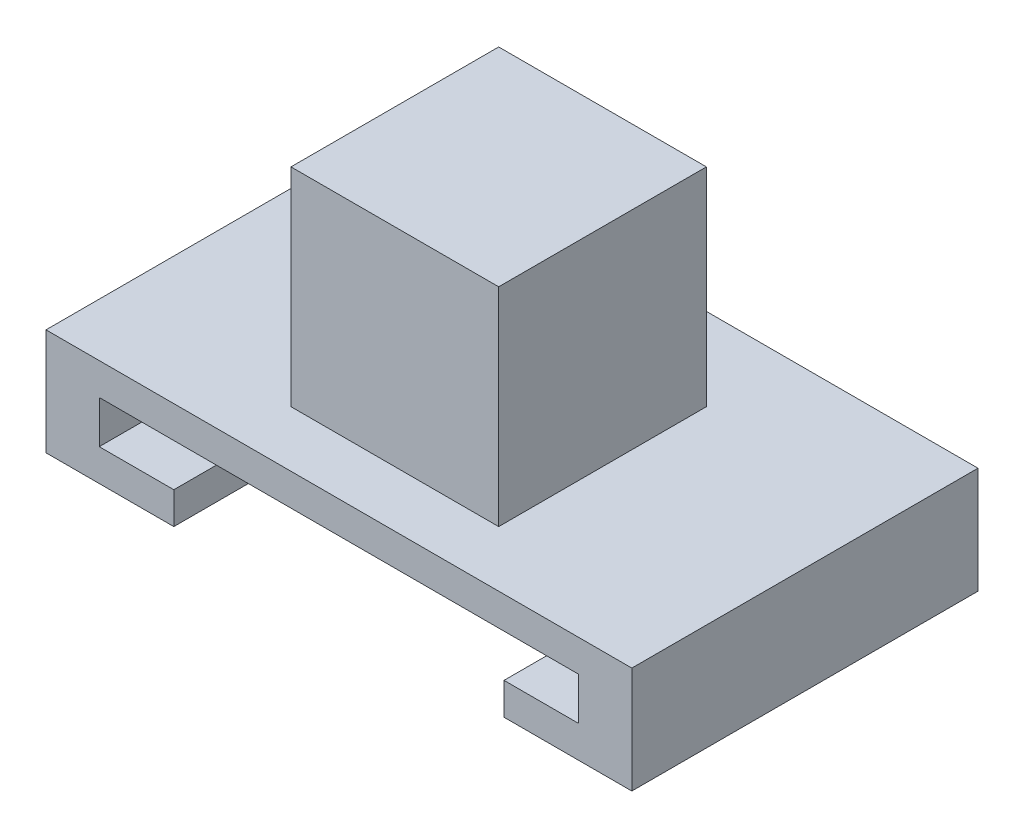
ISO-10303-21;
HEADER;
FILE_DESCRIPTION(('STEP AP214'),'2;1');
FILE_NAME('part.step','',(''),(''),'','','');
FILE_SCHEMA(('AUTOMOTIVE_DESIGN { 1 0 10303 214 1 1 1 1 }'));
ENDSEC;
DATA;
#1=APPLICATION_CONTEXT('core data for automotive mechanical design processes');
#2=APPLICATION_PROTOCOL_DEFINITION('international standard','automotive_design',2000,#1);
#3=PRODUCT_CONTEXT('',#1,'mechanical');
#4=PRODUCT('Part','Part','',(#3));
#5=PRODUCT_RELATED_PRODUCT_CATEGORY('part','',(#4));
#6=PRODUCT_DEFINITION_FORMATION('','',#4);
#7=PRODUCT_DEFINITION_CONTEXT('part definition',#1,'design');
#8=PRODUCT_DEFINITION('design','',#6,#7);
#9=PRODUCT_DEFINITION_SHAPE('','',#8);
#10=(LENGTH_UNIT() NAMED_UNIT(*) SI_UNIT(.MILLI.,.METRE.));
#11=(NAMED_UNIT(*) PLANE_ANGLE_UNIT() SI_UNIT($,.RADIAN.));
#12=(NAMED_UNIT(*) SI_UNIT($,.STERADIAN.) SOLID_ANGLE_UNIT());
#13=UNCERTAINTY_MEASURE_WITH_UNIT(LENGTH_MEASURE(1.E-05),#10,'distance_accuracy_value','');
#14=(GEOMETRIC_REPRESENTATION_CONTEXT(3) GLOBAL_UNCERTAINTY_ASSIGNED_CONTEXT((#13)) GLOBAL_UNIT_ASSIGNED_CONTEXT((#10,
#11,#12)) REPRESENTATION_CONTEXT('',''));
#15=CARTESIAN_POINT('',(0.,0.,0.));
#16=DIRECTION('',(0.,0.,1.));
#17=DIRECTION('',(1.,0.,0.));
#18=AXIS2_PLACEMENT_3D('',#15,#16,#17);
#19=CARTESIAN_POINT('',(0.,10.,30.));
#20=DIRECTION('',(0.,-1.,0.));
#21=DIRECTION('',(0.,0.,-1.));
#22=AXIS2_PLACEMENT_3D('',#19,#20,#21);
#23=PLANE('',#22);
#24=DIRECTION('',(0.,0.,-1.));
#25=VECTOR('',#24,1.);
#26=CARTESIAN_POINT('',(55.,10.,30.));
#27=LINE('',#26,#25);
#28=CARTESIAN_POINT('',(55.,10.,30.));
#29=VERTEX_POINT('',#28);
#30=CARTESIAN_POINT('',(55.,10.,-2.5));
#31=VERTEX_POINT('',#30);
#32=EDGE_CURVE('E168',#29,#31,#27,.T.);
#33=ORIENTED_EDGE('',*,*,#32,.T.);
#34=DIRECTION('',(1.,0.,0.));
#35=VECTOR('',#34,1.);
#36=CARTESIAN_POINT('',(55.,10.,-2.5));
#37=LINE('',#36,#35);
#38=CARTESIAN_POINT('',(0.,10.,-2.5));
#39=VERTEX_POINT('',#38);
#40=EDGE_CURVE('E184',#39,#31,#37,.T.);
#41=ORIENTED_EDGE('',*,*,#40,.F.);
#42=DIRECTION('',(0.,0.,-1.));
#43=VECTOR('',#42,1.);
#44=CARTESIAN_POINT('',(0.,10.,30.));
#45=LINE('',#44,#43);
#46=CARTESIAN_POINT('',(0.,10.,30.));
#47=VERTEX_POINT('',#46);
#48=EDGE_CURVE('E274',#47,#39,#45,.T.);
#49=ORIENTED_EDGE('',*,*,#48,.F.);
#50=DIRECTION('',(-1.,0.,0.));
#51=VECTOR('',#50,1.);
#52=CARTESIAN_POINT('',(0.,10.,30.));
#53=LINE('',#52,#51);
#54=EDGE_CURVE('E271',#29,#47,#53,.T.);
#55=ORIENTED_EDGE('',*,*,#54,.F.);
#56=EDGE_LOOP('',(#33,#41,#49,#55));
#57=FACE_BOUND('',#56,.T.);
#58=DIRECTION('',(0.,0.,1.));
#59=VECTOR('',#58,1.);
#60=CARTESIAN_POINT('',(17.75,10.,5.25));
#61=LINE('',#60,#59);
#62=CARTESIAN_POINT('',(17.75,10.,5.25));
#63=VERTEX_POINT('',#62);
#64=CARTESIAN_POINT('',(17.75,10.,24.75));
#65=VERTEX_POINT('',#64);
#66=EDGE_CURVE('E61',#63,#65,#61,.T.);
#67=ORIENTED_EDGE('',*,*,#66,.F.);
#68=DIRECTION('',(-1.,0.,0.));
#69=VECTOR('',#68,1.);
#70=CARTESIAN_POINT('',(17.75,10.,5.25));
#71=LINE('',#70,#69);
#72=CARTESIAN_POINT('',(37.25,10.,5.25));
#73=VERTEX_POINT('',#72);
#74=EDGE_CURVE('E65',#73,#63,#71,.T.);
#75=ORIENTED_EDGE('',*,*,#74,.F.);
#76=DIRECTION('',(0.,0.,-1.));
#77=VECTOR('',#76,1.);
#78=CARTESIAN_POINT('',(37.25,10.,5.25));
#79=LINE('',#78,#77);
#80=CARTESIAN_POINT('',(37.25,10.,24.75));
#81=VERTEX_POINT('',#80);
#82=EDGE_CURVE('E216',#81,#73,#79,.T.);
#83=ORIENTED_EDGE('',*,*,#82,.F.);
#84=DIRECTION('',(1.,0.,0.));
#85=VECTOR('',#84,1.);
#86=CARTESIAN_POINT('',(17.75,10.,24.75));
#87=LINE('',#86,#85);
#88=EDGE_CURVE('E212',#65,#81,#87,.T.);
#89=ORIENTED_EDGE('',*,*,#88,.F.);
#90=EDGE_LOOP('',(#67,#75,#83,#89));
#91=FACE_BOUND('',#90,.T.);
#92=ADVANCED_FACE('F45',(#57,#91),#23,.F.);
#93=CARTESIAN_POINT('',(0.,0.,30.));
#94=DIRECTION('',(1.,0.,0.));
#95=DIRECTION('',(0.,0.,-1.));
#96=AXIS2_PLACEMENT_3D('',#93,#94,#95);
#97=PLANE('',#96);
#98=ORIENTED_EDGE('',*,*,#48,.T.);
#99=DIRECTION('',(0.,1.,0.));
#100=VECTOR('',#99,1.);
#101=CARTESIAN_POINT('',(0.,10.,-2.5));
#102=LINE('',#101,#100);
#103=CARTESIAN_POINT('',(0.,0.,-2.5));
#104=VERTEX_POINT('',#103);
#105=EDGE_CURVE('E179',#104,#39,#102,.T.);
#106=ORIENTED_EDGE('',*,*,#105,.F.);
#107=DIRECTION('',(0.,0.,-1.));
#108=VECTOR('',#107,1.);
#109=CARTESIAN_POINT('',(0.,0.,30.));
#110=LINE('',#109,#108);
#111=CARTESIAN_POINT('',(0.,0.,30.));
#112=VERTEX_POINT('',#111);
#113=EDGE_CURVE('E11',#112,#104,#110,.T.);
#114=ORIENTED_EDGE('',*,*,#113,.F.);
#115=DIRECTION('',(0.,-1.,0.));
#116=VECTOR('',#115,1.);
#117=CARTESIAN_POINT('',(0.,0.,30.));
#118=LINE('',#117,#116);
#119=EDGE_CURVE('E237',#47,#112,#118,.T.);
#120=ORIENTED_EDGE('',*,*,#119,.F.);
#121=EDGE_LOOP('',(#98,#106,#114,#120));
#122=FACE_BOUND('',#121,.T.);
#123=ADVANCED_FACE('F47',(#122),#97,.F.);
#124=CARTESIAN_POINT('',(12.,0.,30.));
#125=DIRECTION('',(-1.,0.,0.));
#126=DIRECTION('',(0.,0.,1.));
#127=AXIS2_PLACEMENT_3D('',#124,#125,#126);
#128=PLANE('',#127);
#129=DIRECTION('',(0.,1.,0.));
#130=VECTOR('',#129,1.);
#131=CARTESIAN_POINT('',(12.,0.,0.));
#132=LINE('',#131,#130);
#133=CARTESIAN_POINT('',(12.,0.,0.));
#134=VERTEX_POINT('',#133);
#135=CARTESIAN_POINT('',(12.,3.,0.));
#136=VERTEX_POINT('',#135);
#137=EDGE_CURVE('E236',#134,#136,#132,.T.);
#138=ORIENTED_EDGE('',*,*,#137,.T.);
#139=DIRECTION('',(0.,0.,-1.));
#140=VECTOR('',#139,1.);
#141=CARTESIAN_POINT('',(12.,3.,30.));
#142=LINE('',#141,#140);
#143=CARTESIAN_POINT('',(12.,3.,30.));
#144=VERTEX_POINT('',#143);
#145=EDGE_CURVE('E327',#144,#136,#142,.T.);
#146=ORIENTED_EDGE('',*,*,#145,.F.);
#147=DIRECTION('',(0.,1.,0.));
#148=VECTOR('',#147,1.);
#149=CARTESIAN_POINT('',(12.,0.,30.));
#150=LINE('',#149,#148);
#151=CARTESIAN_POINT('',(12.,0.,30.));
#152=VERTEX_POINT('',#151);
#153=EDGE_CURVE('E245',#152,#144,#150,.T.);
#154=ORIENTED_EDGE('',*,*,#153,.F.);
#155=DIRECTION('',(0.,0.,-1.));
#156=VECTOR('',#155,1.);
#157=CARTESIAN_POINT('',(12.,0.,30.));
#158=LINE('',#157,#156);
#159=EDGE_CURVE('E54',#152,#134,#158,.T.);
#160=ORIENTED_EDGE('',*,*,#159,.T.);
#161=EDGE_LOOP('',(#138,#146,#154,#160));
#162=FACE_BOUND('',#161,.T.);
#163=ADVANCED_FACE('F335',(#162),#128,.F.);
#164=CARTESIAN_POINT('',(12.,3.,30.));
#165=DIRECTION('',(0.,-1.,0.));
#166=DIRECTION('',(1.,0.,0.));
#167=AXIS2_PLACEMENT_3D('',#164,#165,#166);
#168=PLANE('',#167);
#169=DIRECTION('',(-1.,0.,0.));
#170=VECTOR('',#169,1.);
#171=CARTESIAN_POINT('',(12.,3.,0.));
#172=LINE('',#171,#170);
#173=CARTESIAN_POINT('',(5.,3.,0.));
#174=VERTEX_POINT('',#173);
#175=EDGE_CURVE('E278',#136,#174,#172,.T.);
#176=ORIENTED_EDGE('',*,*,#175,.T.);
#177=DIRECTION('',(0.,0.,-1.));
#178=VECTOR('',#177,1.);
#179=CARTESIAN_POINT('',(5.,3.,30.));
#180=LINE('',#179,#178);
#181=CARTESIAN_POINT('',(5.,3.,30.));
#182=VERTEX_POINT('',#181);
#183=EDGE_CURVE('E323',#182,#174,#180,.T.);
#184=ORIENTED_EDGE('',*,*,#183,.F.);
#185=DIRECTION('',(-1.,0.,0.));
#186=VECTOR('',#185,1.);
#187=CARTESIAN_POINT('',(12.,3.,30.));
#188=LINE('',#187,#186);
#189=EDGE_CURVE('E248',#144,#182,#188,.T.);
#190=ORIENTED_EDGE('',*,*,#189,.F.);
#191=ORIENTED_EDGE('',*,*,#145,.T.);
#192=EDGE_LOOP('',(#176,#184,#190,#191));
#193=FACE_BOUND('',#192,.T.);
#194=ADVANCED_FACE('F362',(#193),#168,.F.);
#195=CARTESIAN_POINT('',(5.,3.,30.));
#196=DIRECTION('',(-1.,0.,0.));
#197=DIRECTION('',(0.,0.,1.));
#198=AXIS2_PLACEMENT_3D('',#195,#196,#197);
#199=PLANE('',#198);
#200=DIRECTION('',(0.,1.,0.));
#201=VECTOR('',#200,1.);
#202=CARTESIAN_POINT('',(5.,3.,0.));
#203=LINE('',#202,#201);
#204=CARTESIAN_POINT('',(5.,7.,0.));
#205=VERTEX_POINT('',#204);
#206=EDGE_CURVE('E282',#174,#205,#203,.T.);
#207=ORIENTED_EDGE('',*,*,#206,.T.);
#208=DIRECTION('',(0.,0.,-1.));
#209=VECTOR('',#208,1.);
#210=CARTESIAN_POINT('',(5.,7.,30.));
#211=LINE('',#210,#209);
#212=CARTESIAN_POINT('',(5.,7.,30.));
#213=VERTEX_POINT('',#212);
#214=EDGE_CURVE('E319',#213,#205,#211,.T.);
#215=ORIENTED_EDGE('',*,*,#214,.F.);
#216=DIRECTION('',(0.,1.,0.));
#217=VECTOR('',#216,1.);
#218=CARTESIAN_POINT('',(5.,3.,30.));
#219=LINE('',#218,#217);
#220=EDGE_CURVE('E251',#182,#213,#219,.T.);
#221=ORIENTED_EDGE('',*,*,#220,.F.);
#222=ORIENTED_EDGE('',*,*,#183,.T.);
#223=EDGE_LOOP('',(#207,#215,#221,#222));
#224=FACE_BOUND('',#223,.T.);
#225=ADVANCED_FACE('F357',(#224),#199,.F.);
#226=CARTESIAN_POINT('',(5.,7.,30.));
#227=DIRECTION('',(0.,1.,0.));
#228=DIRECTION('',(0.,0.,1.));
#229=AXIS2_PLACEMENT_3D('',#226,#227,#228);
#230=PLANE('',#229);
#231=DIRECTION('',(1.,0.,0.));
#232=VECTOR('',#231,1.);
#233=CARTESIAN_POINT('',(5.,7.,0.));
#234=LINE('',#233,#232);
#235=CARTESIAN_POINT('',(50.,7.,0.));
#236=VERTEX_POINT('',#235);
#237=EDGE_CURVE('E286',#205,#236,#234,.T.);
#238=ORIENTED_EDGE('',*,*,#237,.T.);
#239=DIRECTION('',(0.,0.,-1.));
#240=VECTOR('',#239,1.);
#241=CARTESIAN_POINT('',(50.,7.,30.));
#242=LINE('',#241,#240);
#243=CARTESIAN_POINT('',(50.,7.,30.));
#244=VERTEX_POINT('',#243);
#245=EDGE_CURVE('E315',#244,#236,#242,.T.);
#246=ORIENTED_EDGE('',*,*,#245,.F.);
#247=DIRECTION('',(1.,0.,0.));
#248=VECTOR('',#247,1.);
#249=CARTESIAN_POINT('',(5.,7.,30.));
#250=LINE('',#249,#248);
#251=EDGE_CURVE('E254',#213,#244,#250,.T.);
#252=ORIENTED_EDGE('',*,*,#251,.F.);
#253=ORIENTED_EDGE('',*,*,#214,.T.);
#254=EDGE_LOOP('',(#238,#246,#252,#253));
#255=FACE_BOUND('',#254,.T.);
#256=ADVANCED_FACE('F354',(#255),#230,.F.);
#257=CARTESIAN_POINT('',(50.,3.,30.));
#258=DIRECTION('',(1.,0.,0.));
#259=DIRECTION('',(0.,0.,-1.));
#260=AXIS2_PLACEMENT_3D('',#257,#258,#259);
#261=PLANE('',#260);
#262=DIRECTION('',(0.,-1.,0.));
#263=VECTOR('',#262,1.);
#264=CARTESIAN_POINT('',(50.,3.,0.));
#265=LINE('',#264,#263);
#266=CARTESIAN_POINT('',(50.,3.,0.));
#267=VERTEX_POINT('',#266);
#268=EDGE_CURVE('E290',#236,#267,#265,.T.);
#269=ORIENTED_EDGE('',*,*,#268,.T.);
#270=DIRECTION('',(0.,0.,-1.));
#271=VECTOR('',#270,1.);
#272=CARTESIAN_POINT('',(50.,3.,30.));
#273=LINE('',#272,#271);
#274=CARTESIAN_POINT('',(50.,3.,30.));
#275=VERTEX_POINT('',#274);
#276=EDGE_CURVE('E311',#275,#267,#273,.T.);
#277=ORIENTED_EDGE('',*,*,#276,.F.);
#278=DIRECTION('',(0.,-1.,0.));
#279=VECTOR('',#278,1.);
#280=CARTESIAN_POINT('',(50.,3.,30.));
#281=LINE('',#280,#279);
#282=EDGE_CURVE('E257',#244,#275,#281,.T.);
#283=ORIENTED_EDGE('',*,*,#282,.F.);
#284=ORIENTED_EDGE('',*,*,#245,.T.);
#285=EDGE_LOOP('',(#269,#277,#283,#284));
#286=FACE_BOUND('',#285,.T.);
#287=ADVANCED_FACE('F349',(#286),#261,.F.);
#288=CARTESIAN_POINT('',(43.,3.,30.));
#289=DIRECTION('',(0.,-1.,0.));
#290=DIRECTION('',(1.,0.,0.));
#291=AXIS2_PLACEMENT_3D('',#288,#289,#290);
#292=PLANE('',#291);
#293=DIRECTION('',(-1.,0.,0.));
#294=VECTOR('',#293,1.);
#295=CARTESIAN_POINT('',(43.,3.,0.));
#296=LINE('',#295,#294);
#297=CARTESIAN_POINT('',(43.,3.,0.));
#298=VERTEX_POINT('',#297);
#299=EDGE_CURVE('E294',#267,#298,#296,.T.);
#300=ORIENTED_EDGE('',*,*,#299,.T.);
#301=DIRECTION('',(0.,0.,-1.));
#302=VECTOR('',#301,1.);
#303=CARTESIAN_POINT('',(43.,3.,30.));
#304=LINE('',#303,#302);
#305=CARTESIAN_POINT('',(43.,3.,30.));
#306=VERTEX_POINT('',#305);
#307=EDGE_CURVE('E307',#306,#298,#304,.T.);
#308=ORIENTED_EDGE('',*,*,#307,.F.);
#309=DIRECTION('',(-1.,0.,0.));
#310=VECTOR('',#309,1.);
#311=CARTESIAN_POINT('',(43.,3.,30.));
#312=LINE('',#311,#310);
#313=EDGE_CURVE('E260',#275,#306,#312,.T.);
#314=ORIENTED_EDGE('',*,*,#313,.F.);
#315=ORIENTED_EDGE('',*,*,#276,.T.);
#316=EDGE_LOOP('',(#300,#308,#314,#315));
#317=FACE_BOUND('',#316,.T.);
#318=ADVANCED_FACE('F346',(#317),#292,.F.);
#319=CARTESIAN_POINT('',(43.,0.,30.));
#320=DIRECTION('',(1.,0.,0.));
#321=DIRECTION('',(0.,0.,-1.));
#322=AXIS2_PLACEMENT_3D('',#319,#320,#321);
#323=PLANE('',#322);
#324=DIRECTION('',(0.,-1.,0.));
#325=VECTOR('',#324,1.);
#326=CARTESIAN_POINT('',(43.,0.,0.));
#327=LINE('',#326,#325);
#328=CARTESIAN_POINT('',(43.,0.,0.));
#329=VERTEX_POINT('',#328);
#330=EDGE_CURVE('E242',#298,#329,#327,.T.);
#331=ORIENTED_EDGE('',*,*,#330,.T.);
#332=DIRECTION('',(0.,0.,-1.));
#333=VECTOR('',#332,1.);
#334=CARTESIAN_POINT('',(43.,0.,30.));
#335=LINE('',#334,#333);
#336=CARTESIAN_POINT('',(43.,0.,30.));
#337=VERTEX_POINT('',#336);
#338=EDGE_CURVE('E167',#337,#329,#335,.T.);
#339=ORIENTED_EDGE('',*,*,#338,.F.);
#340=DIRECTION('',(0.,-1.,0.));
#341=VECTOR('',#340,1.);
#342=CARTESIAN_POINT('',(43.,0.,30.));
#343=LINE('',#342,#341);
#344=EDGE_CURVE('E263',#306,#337,#343,.T.);
#345=ORIENTED_EDGE('',*,*,#344,.F.);
#346=ORIENTED_EDGE('',*,*,#307,.T.);
#347=EDGE_LOOP('',(#331,#339,#345,#346));
#348=FACE_BOUND('',#347,.T.);
#349=ADVANCED_FACE('F341',(#348),#323,.F.);
#350=CARTESIAN_POINT('',(55.,0.,30.));
#351=DIRECTION('',(0.,1.,0.));
#352=DIRECTION('',(0.,0.,1.));
#353=AXIS2_PLACEMENT_3D('',#350,#351,#352);
#354=PLANE('',#353);
#355=ORIENTED_EDGE('',*,*,#338,.T.);
#356=DIRECTION('',(-1.,0.,0.));
#357=VECTOR('',#356,1.);
#358=CARTESIAN_POINT('',(55.,0.,0.));
#359=LINE('',#358,#357);
#360=EDGE_CURVE('E186',#329,#134,#359,.T.);
#361=ORIENTED_EDGE('',*,*,#360,.T.);
#362=ORIENTED_EDGE('',*,*,#159,.F.);
#363=DIRECTION('',(1.,0.,0.));
#364=VECTOR('',#363,1.);
#365=CARTESIAN_POINT('',(0.,0.,30.));
#366=LINE('',#365,#364);
#367=EDGE_CURVE('E241',#112,#152,#366,.T.);
#368=ORIENTED_EDGE('',*,*,#367,.F.);
#369=ORIENTED_EDGE('',*,*,#113,.T.);
#370=DIRECTION('',(-1.,0.,0.));
#371=VECTOR('',#370,1.);
#372=CARTESIAN_POINT('',(55.,0.,-2.5));
#373=LINE('',#372,#371);
#374=CARTESIAN_POINT('',(55.,0.,-2.5));
#375=VERTEX_POINT('',#374);
#376=EDGE_CURVE('E171',#375,#104,#373,.T.);
#377=ORIENTED_EDGE('',*,*,#376,.F.);
#378=DIRECTION('',(0.,0.,-1.));
#379=VECTOR('',#378,1.);
#380=CARTESIAN_POINT('',(55.,0.,30.));
#381=LINE('',#380,#379);
#382=CARTESIAN_POINT('',(55.,0.,30.));
#383=VERTEX_POINT('',#382);
#384=EDGE_CURVE('E157',#383,#375,#381,.T.);
#385=ORIENTED_EDGE('',*,*,#384,.F.);
#386=DIRECTION('',(1.,0.,0.));
#387=VECTOR('',#386,1.);
#388=CARTESIAN_POINT('',(55.,0.,30.));
#389=LINE('',#388,#387);
#390=EDGE_CURVE('E266',#337,#383,#389,.T.);
#391=ORIENTED_EDGE('',*,*,#390,.F.);
#392=EDGE_LOOP('',(#355,#361,#362,#368,#369,#377,#385,#391));
#393=FACE_BOUND('',#392,.T.);
#394=ADVANCED_FACE('F173',(#393),#354,.F.);
#395=CARTESIAN_POINT('',(55.,0.,30.));
#396=DIRECTION('',(-1.,0.,0.));
#397=DIRECTION('',(0.,0.,1.));
#398=AXIS2_PLACEMENT_3D('',#395,#396,#397);
#399=PLANE('',#398);
#400=ORIENTED_EDGE('',*,*,#384,.T.);
#401=DIRECTION('',(0.,-1.,0.));
#402=VECTOR('',#401,1.);
#403=CARTESIAN_POINT('',(55.,10.,-2.5));
#404=LINE('',#403,#402);
#405=EDGE_CURVE('E162',#31,#375,#404,.T.);
#406=ORIENTED_EDGE('',*,*,#405,.F.);
#407=ORIENTED_EDGE('',*,*,#32,.F.);
#408=DIRECTION('',(0.,1.,0.));
#409=VECTOR('',#408,1.);
#410=CARTESIAN_POINT('',(55.,0.,30.));
#411=LINE('',#410,#409);
#412=EDGE_CURVE('E163',#383,#29,#411,.T.);
#413=ORIENTED_EDGE('',*,*,#412,.F.);
#414=EDGE_LOOP('',(#400,#406,#407,#413));
#415=FACE_BOUND('',#414,.T.);
#416=ADVANCED_FACE('F159',(#415),#399,.F.);
#417=CARTESIAN_POINT('',(0.,0.,30.));
#418=DIRECTION('',(0.,0.,-1.));
#419=DIRECTION('',(-1.,0.,0.));
#420=AXIS2_PLACEMENT_3D('',#417,#418,#419);
#421=PLANE('',#420);
#422=ORIENTED_EDGE('',*,*,#119,.T.);
#423=ORIENTED_EDGE('',*,*,#367,.T.);
#424=ORIENTED_EDGE('',*,*,#153,.T.);
#425=ORIENTED_EDGE('',*,*,#189,.T.);
#426=ORIENTED_EDGE('',*,*,#220,.T.);
#427=ORIENTED_EDGE('',*,*,#251,.T.);
#428=ORIENTED_EDGE('',*,*,#282,.T.);
#429=ORIENTED_EDGE('',*,*,#313,.T.);
#430=ORIENTED_EDGE('',*,*,#344,.T.);
#431=ORIENTED_EDGE('',*,*,#390,.T.);
#432=ORIENTED_EDGE('',*,*,#412,.T.);
#433=ORIENTED_EDGE('',*,*,#54,.T.);
#434=EDGE_LOOP('',(#422,#423,#424,#425,#426,#427,#428,#429,#430,#431,#432,#433));
#435=FACE_BOUND('',#434,.T.);
#436=ADVANCED_FACE('F364',(#435),#421,.F.);
#437=CARTESIAN_POINT('',(17.75,29.5,5.25));
#438=DIRECTION('',(1.,0.,0.));
#439=DIRECTION('',(0.,0.,-1.));
#440=AXIS2_PLACEMENT_3D('',#437,#438,#439);
#441=PLANE('',#440);
#442=ORIENTED_EDGE('',*,*,#66,.T.);
#443=DIRECTION('',(0.,-1.,0.));
#444=VECTOR('',#443,1.);
#445=CARTESIAN_POINT('',(17.75,29.5,24.75));
#446=LINE('',#445,#444);
#447=CARTESIAN_POINT('',(17.75,29.5,24.75));
#448=VERTEX_POINT('',#447);
#449=EDGE_CURVE('E232',#448,#65,#446,.T.);
#450=ORIENTED_EDGE('',*,*,#449,.F.);
#451=DIRECTION('',(0.,0.,1.));
#452=VECTOR('',#451,1.);
#453=CARTESIAN_POINT('',(17.75,29.5,5.25));
#454=LINE('',#453,#452);
#455=CARTESIAN_POINT('',(17.75,29.5,5.25));
#456=VERTEX_POINT('',#455);
#457=EDGE_CURVE('E196',#456,#448,#454,.T.);
#458=ORIENTED_EDGE('',*,*,#457,.F.);
#459=DIRECTION('',(0.,-1.,0.));
#460=VECTOR('',#459,1.);
#461=CARTESIAN_POINT('',(17.75,29.5,5.25));
#462=LINE('',#461,#460);
#463=EDGE_CURVE('E209',#456,#63,#462,.T.);
#464=ORIENTED_EDGE('',*,*,#463,.T.);
#465=EDGE_LOOP('',(#442,#450,#458,#464));
#466=FACE_BOUND('',#465,.T.);
#467=ADVANCED_FACE('F492',(#466),#441,.F.);
#468=CARTESIAN_POINT('',(17.75,29.5,24.75));
#469=DIRECTION('',(0.,0.,-1.));
#470=DIRECTION('',(-1.,0.,0.));
#471=AXIS2_PLACEMENT_3D('',#468,#469,#470);
#472=PLANE('',#471);
#473=ORIENTED_EDGE('',*,*,#88,.T.);
#474=DIRECTION('',(0.,-1.,0.));
#475=VECTOR('',#474,1.);
#476=CARTESIAN_POINT('',(37.25,29.5,24.75));
#477=LINE('',#476,#475);
#478=CARTESIAN_POINT('',(37.25,29.5,24.75));
#479=VERTEX_POINT('',#478);
#480=EDGE_CURVE('E228',#479,#81,#477,.T.);
#481=ORIENTED_EDGE('',*,*,#480,.F.);
#482=DIRECTION('',(1.,0.,0.));
#483=VECTOR('',#482,1.);
#484=CARTESIAN_POINT('',(17.75,29.5,24.75));
#485=LINE('',#484,#483);
#486=EDGE_CURVE('E200',#448,#479,#485,.T.);
#487=ORIENTED_EDGE('',*,*,#486,.F.);
#488=ORIENTED_EDGE('',*,*,#449,.T.);
#489=EDGE_LOOP('',(#473,#481,#487,#488));
#490=FACE_BOUND('',#489,.T.);
#491=ADVANCED_FACE('F483',(#490),#472,.F.);
#492=CARTESIAN_POINT('',(37.25,29.5,5.25));
#493=DIRECTION('',(-1.,0.,0.));
#494=DIRECTION('',(0.,0.,1.));
#495=AXIS2_PLACEMENT_3D('',#492,#493,#494);
#496=PLANE('',#495);
#497=ORIENTED_EDGE('',*,*,#82,.T.);
#498=DIRECTION('',(0.,-1.,0.));
#499=VECTOR('',#498,1.);
#500=CARTESIAN_POINT('',(37.25,29.5,5.25));
#501=LINE('',#500,#499);
#502=CARTESIAN_POINT('',(37.25,29.5,5.25));
#503=VERTEX_POINT('',#502);
#504=EDGE_CURVE('E224',#503,#73,#501,.T.);
#505=ORIENTED_EDGE('',*,*,#504,.F.);
#506=DIRECTION('',(0.,0.,-1.));
#507=VECTOR('',#506,1.);
#508=CARTESIAN_POINT('',(37.25,29.5,5.25));
#509=LINE('',#508,#507);
#510=EDGE_CURVE('E203',#479,#503,#509,.T.);
#511=ORIENTED_EDGE('',*,*,#510,.F.);
#512=ORIENTED_EDGE('',*,*,#480,.T.);
#513=EDGE_LOOP('',(#497,#505,#511,#512));
#514=FACE_BOUND('',#513,.T.);
#515=ADVANCED_FACE('F474',(#514),#496,.F.);
#516=CARTESIAN_POINT('',(17.75,29.5,5.25));
#517=DIRECTION('',(0.,0.,1.));
#518=DIRECTION('',(1.,0.,0.));
#519=AXIS2_PLACEMENT_3D('',#516,#517,#518);
#520=PLANE('',#519);
#521=ORIENTED_EDGE('',*,*,#74,.T.);
#522=ORIENTED_EDGE('',*,*,#463,.F.);
#523=DIRECTION('',(-1.,0.,0.));
#524=VECTOR('',#523,1.);
#525=CARTESIAN_POINT('',(17.75,29.5,5.25));
#526=LINE('',#525,#524);
#527=EDGE_CURVE('E206',#503,#456,#526,.T.);
#528=ORIENTED_EDGE('',*,*,#527,.F.);
#529=ORIENTED_EDGE('',*,*,#504,.T.);
#530=EDGE_LOOP('',(#521,#522,#528,#529));
#531=FACE_BOUND('',#530,.T.);
#532=ADVANCED_FACE('F465',(#531),#520,.F.);
#533=CARTESIAN_POINT('',(0.,29.5,0.));
#534=DIRECTION('',(0.,1.,0.));
#535=DIRECTION('',(0.,0.,1.));
#536=AXIS2_PLACEMENT_3D('',#533,#534,#535);
#537=PLANE('',#536);
#538=ORIENTED_EDGE('',*,*,#457,.T.);
#539=ORIENTED_EDGE('',*,*,#486,.T.);
#540=ORIENTED_EDGE('',*,*,#510,.T.);
#541=ORIENTED_EDGE('',*,*,#527,.T.);
#542=EDGE_LOOP('',(#538,#539,#540,#541));
#543=FACE_BOUND('',#542,.T.);
#544=ADVANCED_FACE('F448',(#543),#537,.T.);
#545=CARTESIAN_POINT('',(0.,0.,-2.5));
#546=DIRECTION('',(0.,0.,-1.));
#547=DIRECTION('',(-1.,0.,0.));
#548=AXIS2_PLACEMENT_3D('',#545,#546,#547);
#549=PLANE('',#548);
#550=ORIENTED_EDGE('',*,*,#405,.T.);
#551=ORIENTED_EDGE('',*,*,#376,.T.);
#552=ORIENTED_EDGE('',*,*,#105,.T.);
#553=ORIENTED_EDGE('',*,*,#40,.T.);
#554=EDGE_LOOP('',(#550,#551,#552,#553));
#555=FACE_BOUND('',#554,.T.);
#556=ADVANCED_FACE('F182',(#555),#549,.T.);
#557=CARTESIAN_POINT('',(0.,0.,0.));
#558=DIRECTION('',(0.,0.,-1.));
#559=DIRECTION('',(-1.,0.,0.));
#560=AXIS2_PLACEMENT_3D('',#557,#558,#559);
#561=PLANE('',#560);
#562=ORIENTED_EDGE('',*,*,#330,.F.);
#563=ORIENTED_EDGE('',*,*,#299,.F.);
#564=ORIENTED_EDGE('',*,*,#268,.F.);
#565=ORIENTED_EDGE('',*,*,#237,.F.);
#566=ORIENTED_EDGE('',*,*,#206,.F.);
#567=ORIENTED_EDGE('',*,*,#175,.F.);
#568=ORIENTED_EDGE('',*,*,#137,.F.);
#569=ORIENTED_EDGE('',*,*,#360,.F.);
#570=EDGE_LOOP('',(#562,#563,#564,#565,#566,#567,#568,#569));
#571=FACE_BOUND('',#570,.T.);
#572=ADVANCED_FACE('F339',(#571),#561,.F.);
#573=CLOSED_SHELL('',(#92,#123,#163,#194,#225,#256,#287,#318,#349,#394,#416,#436,#467,#491,#515,
#532,#544,#556,#572));
#574=MANIFOLD_SOLID_BREP('B2',#573);
#575=ADVANCED_BREP_SHAPE_REPRESENTATION('',(#18,#574),#14);
#576=SHAPE_DEFINITION_REPRESENTATION(#9,#575);
ENDSEC;
END-ISO-10303-21;
